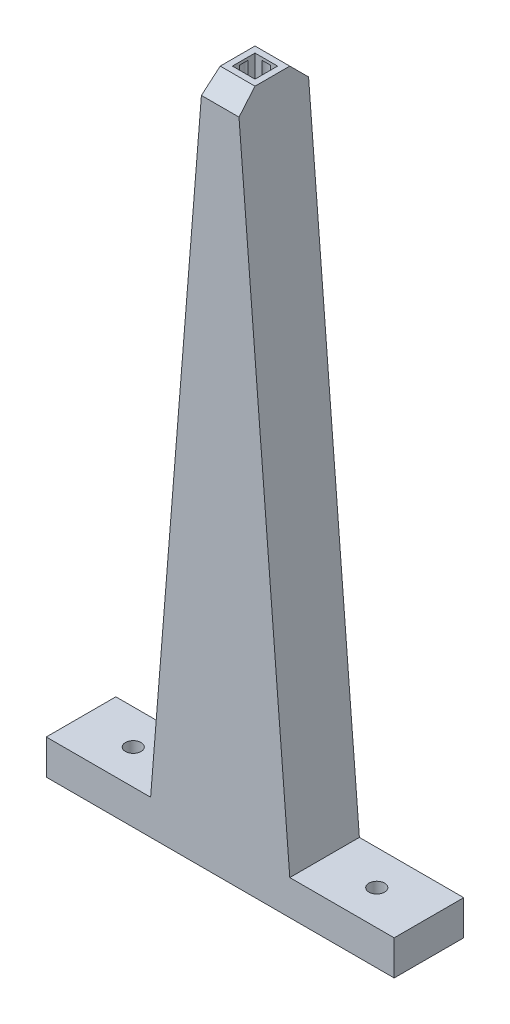
ISO-10303-21;
HEADER;
FILE_DESCRIPTION(('STEP AP214'),'2;1');
FILE_NAME('part.step','',(''),(''),'','','');
FILE_SCHEMA(('AUTOMOTIVE_DESIGN { 1 0 10303 214 1 1 1 1 }'));
ENDSEC;
DATA;
#1=APPLICATION_CONTEXT('core data for automotive mechanical design processes');
#2=APPLICATION_PROTOCOL_DEFINITION('international standard','automotive_design',2000,#1);
#3=PRODUCT_CONTEXT('',#1,'mechanical');
#4=PRODUCT('Part','Part','',(#3));
#5=PRODUCT_RELATED_PRODUCT_CATEGORY('part','',(#4));
#6=PRODUCT_DEFINITION_FORMATION('','',#4);
#7=PRODUCT_DEFINITION_CONTEXT('part definition',#1,'design');
#8=PRODUCT_DEFINITION('design','',#6,#7);
#9=PRODUCT_DEFINITION_SHAPE('','',#8);
#10=(LENGTH_UNIT() NAMED_UNIT(*) SI_UNIT(.MILLI.,.METRE.));
#11=(NAMED_UNIT(*) PLANE_ANGLE_UNIT() SI_UNIT($,.RADIAN.));
#12=(NAMED_UNIT(*) SI_UNIT($,.STERADIAN.) SOLID_ANGLE_UNIT());
#13=UNCERTAINTY_MEASURE_WITH_UNIT(LENGTH_MEASURE(1.E-05),#10,'distance_accuracy_value','');
#14=(GEOMETRIC_REPRESENTATION_CONTEXT(3) GLOBAL_UNCERTAINTY_ASSIGNED_CONTEXT((#13)) GLOBAL_UNIT_ASSIGNED_CONTEXT((#10,
#11,#12)) REPRESENTATION_CONTEXT('',''));
#15=CARTESIAN_POINT('',(0.,0.,0.));
#16=DIRECTION('',(0.,0.,1.));
#17=DIRECTION('',(1.,0.,0.));
#18=AXIS2_PLACEMENT_3D('',#15,#16,#17);
#19=CARTESIAN_POINT('',(46.7500000000002,182.,6.75));
#20=DIRECTION('',(-1.,0.,0.));
#21=DIRECTION('',(0.,0.,1.));
#22=AXIS2_PLACEMENT_3D('',#19,#20,#21);
#23=PLANE('',#22);
#24=DIRECTION('',(0.,0.,1.));
#25=VECTOR('',#24,1.);
#26=CARTESIAN_POINT('',(46.7500000000002,197.,6.75));
#27=LINE('',#26,#25);
#28=CARTESIAN_POINT('',(46.7500000000002,197.,6.75));
#29=VERTEX_POINT('',#28);
#30=CARTESIAN_POINT('',(46.7500000000002,197.,13.25));
#31=VERTEX_POINT('',#30);
#32=EDGE_CURVE('E251',#29,#31,#27,.T.);
#33=ORIENTED_EDGE('',*,*,#32,.T.);
#34=DIRECTION('',(0.,1.,0.));
#35=VECTOR('',#34,1.);
#36=CARTESIAN_POINT('',(46.7500000000002,182.,13.25));
#37=LINE('',#36,#35);
#38=CARTESIAN_POINT('',(46.7500000000002,182.,13.25));
#39=VERTEX_POINT('',#38);
#40=EDGE_CURVE('E324',#39,#31,#37,.T.);
#41=ORIENTED_EDGE('',*,*,#40,.F.);
#42=DIRECTION('',(0.,0.,1.));
#43=VECTOR('',#42,1.);
#44=CARTESIAN_POINT('',(46.7500000000002,182.,6.75));
#45=LINE('',#44,#43);
#46=CARTESIAN_POINT('',(46.7500000000002,182.,6.75));
#47=VERTEX_POINT('',#46);
#48=EDGE_CURVE('E307',#47,#39,#45,.T.);
#49=ORIENTED_EDGE('',*,*,#48,.F.);
#50=DIRECTION('',(0.,1.,0.));
#51=VECTOR('',#50,1.);
#52=CARTESIAN_POINT('',(46.7500000000002,182.,6.75));
#53=LINE('',#52,#51);
#54=EDGE_CURVE('E338',#47,#29,#53,.T.);
#55=ORIENTED_EDGE('',*,*,#54,.T.);
#56=EDGE_LOOP('',(#33,#41,#49,#55));
#57=FACE_BOUND('',#56,.T.);
#58=DIRECTION('',(0.,0.,-1.));
#59=VECTOR('',#58,1.);
#60=CARTESIAN_POINT('',(46.7500000000002,196.2,6.75));
#61=LINE('',#60,#59);
#62=CARTESIAN_POINT('',(46.7500000000002,196.2,11.25));
#63=VERTEX_POINT('',#62);
#64=CARTESIAN_POINT('',(46.7500000000002,196.2,8.75));
#65=VERTEX_POINT('',#64);
#66=EDGE_CURVE('E426',#63,#65,#61,.T.);
#67=ORIENTED_EDGE('',*,*,#66,.T.);
#68=DIRECTION('',(0.,1.,0.));
#69=VECTOR('',#68,1.);
#70=CARTESIAN_POINT('',(46.7500000000002,192.,8.75));
#71=LINE('',#70,#69);
#72=CARTESIAN_POINT('',(46.7500000000002,192.,8.75));
#73=VERTEX_POINT('',#72);
#74=EDGE_CURVE('E284',#73,#65,#71,.T.);
#75=ORIENTED_EDGE('',*,*,#74,.F.);
#76=DIRECTION('',(0.,0.,-1.));
#77=VECTOR('',#76,1.);
#78=CARTESIAN_POINT('',(46.7500000000002,192.,8.75));
#79=LINE('',#78,#77);
#80=CARTESIAN_POINT('',(46.7500000000002,192.,11.25));
#81=VERTEX_POINT('',#80);
#82=EDGE_CURVE('E293',#81,#73,#79,.T.);
#83=ORIENTED_EDGE('',*,*,#82,.F.);
#84=DIRECTION('',(0.,1.,0.));
#85=VECTOR('',#84,1.);
#86=CARTESIAN_POINT('',(46.7500000000002,192.,11.25));
#87=LINE('',#86,#85);
#88=EDGE_CURVE('E298',#81,#63,#87,.T.);
#89=ORIENTED_EDGE('',*,*,#88,.T.);
#90=EDGE_LOOP('',(#67,#75,#83,#89));
#91=FACE_BOUND('',#90,.T.);
#92=ADVANCED_FACE('F42',(#57,#91),#23,.F.);
#93=CARTESIAN_POINT('',(46.7500000000002,182.,6.75));
#94=DIRECTION('',(0.,0.,-1.));
#95=DIRECTION('',(-1.,0.,0.));
#96=AXIS2_PLACEMENT_3D('',#93,#94,#95);
#97=PLANE('',#96);
#98=DIRECTION('',(-1.,0.,0.));
#99=VECTOR('',#98,1.);
#100=CARTESIAN_POINT('',(46.7500000000002,197.,6.75));
#101=LINE('',#100,#99);
#102=CARTESIAN_POINT('',(53.2500000000002,197.,6.75));
#103=VERTEX_POINT('',#102);
#104=EDGE_CURVE('E312',#103,#29,#101,.T.);
#105=ORIENTED_EDGE('',*,*,#104,.T.);
#106=ORIENTED_EDGE('',*,*,#54,.F.);
#107=DIRECTION('',(-1.,0.,0.));
#108=VECTOR('',#107,1.);
#109=CARTESIAN_POINT('',(46.7500000000002,182.,6.75));
#110=LINE('',#109,#108);
#111=CARTESIAN_POINT('',(53.2500000000002,182.,6.75));
#112=VERTEX_POINT('',#111);
#113=EDGE_CURVE('E320',#112,#47,#110,.T.);
#114=ORIENTED_EDGE('',*,*,#113,.F.);
#115=DIRECTION('',(0.,1.,0.));
#116=VECTOR('',#115,1.);
#117=CARTESIAN_POINT('',(53.2500000000002,182.,6.75));
#118=LINE('',#117,#116);
#119=EDGE_CURVE('E342',#112,#103,#118,.T.);
#120=ORIENTED_EDGE('',*,*,#119,.T.);
#121=EDGE_LOOP('',(#105,#106,#114,#120));
#122=FACE_BOUND('',#121,.T.);
#123=DIRECTION('',(1.,0.,0.));
#124=VECTOR('',#123,1.);
#125=CARTESIAN_POINT('',(46.7500000000002,196.2,6.75));
#126=LINE('',#125,#124);
#127=CARTESIAN_POINT('',(48.7500000000002,196.2,6.75));
#128=VERTEX_POINT('',#127);
#129=CARTESIAN_POINT('',(51.2500000000002,196.2,6.75));
#130=VERTEX_POINT('',#129);
#131=EDGE_CURVE('E433',#128,#130,#126,.T.);
#132=ORIENTED_EDGE('',*,*,#131,.T.);
#133=DIRECTION('',(0.,1.,0.));
#134=VECTOR('',#133,1.);
#135=CARTESIAN_POINT('',(51.2500000000002,192.,6.75));
#136=LINE('',#135,#134);
#137=CARTESIAN_POINT('',(51.2500000000002,192.,6.75));
#138=VERTEX_POINT('',#137);
#139=EDGE_CURVE('E233',#138,#130,#136,.T.);
#140=ORIENTED_EDGE('',*,*,#139,.F.);
#141=DIRECTION('',(1.,0.,0.));
#142=VECTOR('',#141,1.);
#143=CARTESIAN_POINT('',(48.7500000000002,192.,6.75));
#144=LINE('',#143,#142);
#145=CARTESIAN_POINT('',(48.7500000000002,192.,6.75));
#146=VERTEX_POINT('',#145);
#147=EDGE_CURVE('E234',#146,#138,#144,.T.);
#148=ORIENTED_EDGE('',*,*,#147,.F.);
#149=DIRECTION('',(0.,1.,0.));
#150=VECTOR('',#149,1.);
#151=CARTESIAN_POINT('',(48.7500000000002,192.,6.75));
#152=LINE('',#151,#150);
#153=EDGE_CURVE('E220',#146,#128,#152,.T.);
#154=ORIENTED_EDGE('',*,*,#153,.T.);
#155=EDGE_LOOP('',(#132,#140,#148,#154));
#156=FACE_BOUND('',#155,.T.);
#157=ADVANCED_FACE('F242',(#122,#156),#97,.F.);
#158=CARTESIAN_POINT('',(53.2500000000002,182.,6.75));
#159=DIRECTION('',(1.,0.,0.));
#160=DIRECTION('',(0.,0.,-1.));
#161=AXIS2_PLACEMENT_3D('',#158,#159,#160);
#162=PLANE('',#161);
#163=DIRECTION('',(0.,0.,-1.));
#164=VECTOR('',#163,1.);
#165=CARTESIAN_POINT('',(53.2500000000002,197.,6.75));
#166=LINE('',#165,#164);
#167=CARTESIAN_POINT('',(53.2500000000002,197.,13.25));
#168=VERTEX_POINT('',#167);
#169=EDGE_CURVE('E331',#168,#103,#166,.T.);
#170=ORIENTED_EDGE('',*,*,#169,.T.);
#171=ORIENTED_EDGE('',*,*,#119,.F.);
#172=DIRECTION('',(0.,0.,-1.));
#173=VECTOR('',#172,1.);
#174=CARTESIAN_POINT('',(53.2500000000002,182.,6.75));
#175=LINE('',#174,#173);
#176=CARTESIAN_POINT('',(53.2500000000002,182.,13.25));
#177=VERTEX_POINT('',#176);
#178=EDGE_CURVE('E316',#177,#112,#175,.T.);
#179=ORIENTED_EDGE('',*,*,#178,.F.);
#180=DIRECTION('',(0.,1.,0.));
#181=VECTOR('',#180,1.);
#182=CARTESIAN_POINT('',(53.2500000000002,182.,13.25));
#183=LINE('',#182,#181);
#184=EDGE_CURVE('E345',#177,#168,#183,.T.);
#185=ORIENTED_EDGE('',*,*,#184,.T.);
#186=EDGE_LOOP('',(#170,#171,#179,#185));
#187=FACE_BOUND('',#186,.T.);
#188=DIRECTION('',(0.,0.,1.));
#189=VECTOR('',#188,1.);
#190=CARTESIAN_POINT('',(53.2500000000002,196.2,6.75));
#191=LINE('',#190,#189);
#192=CARTESIAN_POINT('',(53.2500000000002,196.2,8.74999999999999));
#193=VERTEX_POINT('',#192);
#194=CARTESIAN_POINT('',(53.2500000000002,196.2,11.25));
#195=VERTEX_POINT('',#194);
#196=EDGE_CURVE('E439',#193,#195,#191,.T.);
#197=ORIENTED_EDGE('',*,*,#196,.T.);
#198=DIRECTION('',(0.,1.,0.));
#199=VECTOR('',#198,1.);
#200=CARTESIAN_POINT('',(53.2500000000002,192.,11.25));
#201=LINE('',#200,#199);
#202=CARTESIAN_POINT('',(53.2500000000002,192.,11.25));
#203=VERTEX_POINT('',#202);
#204=EDGE_CURVE('E249',#203,#195,#201,.T.);
#205=ORIENTED_EDGE('',*,*,#204,.F.);
#206=DIRECTION('',(0.,0.,1.));
#207=VECTOR('',#206,1.);
#208=CARTESIAN_POINT('',(53.2500000000002,192.,8.74999999999999));
#209=LINE('',#208,#207);
#210=CARTESIAN_POINT('',(53.2500000000002,192.,8.74999999999999));
#211=VERTEX_POINT('',#210);
#212=EDGE_CURVE('E257',#211,#203,#209,.T.);
#213=ORIENTED_EDGE('',*,*,#212,.F.);
#214=DIRECTION('',(0.,1.,0.));
#215=VECTOR('',#214,1.);
#216=CARTESIAN_POINT('',(53.2500000000002,192.,8.74999999999999));
#217=LINE('',#216,#215);
#218=EDGE_CURVE('E262',#211,#193,#217,.T.);
#219=ORIENTED_EDGE('',*,*,#218,.T.);
#220=EDGE_LOOP('',(#197,#205,#213,#219));
#221=FACE_BOUND('',#220,.T.);
#222=ADVANCED_FACE('F541',(#187,#221),#162,.F.);
#223=CARTESIAN_POINT('',(46.7500000000002,182.,13.25));
#224=DIRECTION('',(0.,0.,1.));
#225=DIRECTION('',(1.,0.,0.));
#226=AXIS2_PLACEMENT_3D('',#223,#224,#225);
#227=PLANE('',#226);
#228=DIRECTION('',(1.,0.,0.));
#229=VECTOR('',#228,1.);
#230=CARTESIAN_POINT('',(46.7500000000002,197.,13.25));
#231=LINE('',#230,#229);
#232=EDGE_CURVE('E327',#31,#168,#231,.T.);
#233=ORIENTED_EDGE('',*,*,#232,.T.);
#234=ORIENTED_EDGE('',*,*,#184,.F.);
#235=DIRECTION('',(1.,0.,0.));
#236=VECTOR('',#235,1.);
#237=CARTESIAN_POINT('',(46.7500000000002,182.,13.25));
#238=LINE('',#237,#236);
#239=EDGE_CURVE('E311',#39,#177,#238,.T.);
#240=ORIENTED_EDGE('',*,*,#239,.F.);
#241=ORIENTED_EDGE('',*,*,#40,.T.);
#242=EDGE_LOOP('',(#233,#234,#240,#241));
#243=FACE_BOUND('',#242,.T.);
#244=DIRECTION('',(-1.,0.,0.));
#245=VECTOR('',#244,1.);
#246=CARTESIAN_POINT('',(46.7500000000002,196.2,13.25));
#247=LINE('',#246,#245);
#248=CARTESIAN_POINT('',(51.2500000000002,196.2,13.25));
#249=VERTEX_POINT('',#248);
#250=CARTESIAN_POINT('',(48.7500000000002,196.2,13.25));
#251=VERTEX_POINT('',#250);
#252=EDGE_CURVE('E446',#249,#251,#247,.T.);
#253=ORIENTED_EDGE('',*,*,#252,.T.);
#254=DIRECTION('',(0.,1.,0.));
#255=VECTOR('',#254,1.);
#256=CARTESIAN_POINT('',(48.7500000000002,192.,13.25));
#257=LINE('',#256,#255);
#258=CARTESIAN_POINT('',(48.7500000000002,192.,13.25));
#259=VERTEX_POINT('',#258);
#260=EDGE_CURVE('E266',#259,#251,#257,.T.);
#261=ORIENTED_EDGE('',*,*,#260,.F.);
#262=DIRECTION('',(-1.,0.,0.));
#263=VECTOR('',#262,1.);
#264=CARTESIAN_POINT('',(48.7500000000002,192.,13.25));
#265=LINE('',#264,#263);
#266=CARTESIAN_POINT('',(51.2500000000002,192.,13.25));
#267=VERTEX_POINT('',#266);
#268=EDGE_CURVE('E275',#267,#259,#265,.T.);
#269=ORIENTED_EDGE('',*,*,#268,.F.);
#270=DIRECTION('',(0.,1.,0.));
#271=VECTOR('',#270,1.);
#272=CARTESIAN_POINT('',(51.2500000000002,192.,13.25));
#273=LINE('',#272,#271);
#274=EDGE_CURVE('E280',#267,#249,#273,.T.);
#275=ORIENTED_EDGE('',*,*,#274,.T.);
#276=EDGE_LOOP('',(#253,#261,#269,#275));
#277=FACE_BOUND('',#276,.T.);
#278=ADVANCED_FACE('F547',(#243,#277),#227,.F.);
#279=CARTESIAN_POINT('',(0.,10.,20.));
#280=DIRECTION('',(1.,0.,0.));
#281=DIRECTION('',(0.,0.,-1.));
#282=AXIS2_PLACEMENT_3D('',#279,#280,#281);
#283=PLANE('',#282);
#284=DIRECTION('',(0.,-1.,0.));
#285=VECTOR('',#284,1.);
#286=CARTESIAN_POINT('',(0.,10.,0.));
#287=LINE('',#286,#285);
#288=CARTESIAN_POINT('',(0.,10.,0.));
#289=VERTEX_POINT('',#288);
#290=CARTESIAN_POINT('',(0.,0.,0.));
#291=VERTEX_POINT('',#290);
#292=EDGE_CURVE('E341',#289,#291,#287,.T.);
#293=ORIENTED_EDGE('',*,*,#292,.T.);
#294=DIRECTION('',(0.,0.,-1.));
#295=VECTOR('',#294,1.);
#296=CARTESIAN_POINT('',(0.,0.,20.));
#297=LINE('',#296,#295);
#298=CARTESIAN_POINT('',(0.,0.,20.));
#299=VERTEX_POINT('',#298);
#300=EDGE_CURVE('E422',#299,#291,#297,.T.);
#301=ORIENTED_EDGE('',*,*,#300,.F.);
#302=DIRECTION('',(0.,-1.,0.));
#303=VECTOR('',#302,1.);
#304=CARTESIAN_POINT('',(0.,10.,20.));
#305=LINE('',#304,#303);
#306=CARTESIAN_POINT('',(0.,10.,20.));
#307=VERTEX_POINT('',#306);
#308=EDGE_CURVE('E351',#307,#299,#305,.T.);
#309=ORIENTED_EDGE('',*,*,#308,.F.);
#310=DIRECTION('',(0.,0.,-1.));
#311=VECTOR('',#310,1.);
#312=CARTESIAN_POINT('',(0.,10.,20.));
#313=LINE('',#312,#311);
#314=EDGE_CURVE('E374',#307,#289,#313,.T.);
#315=ORIENTED_EDGE('',*,*,#314,.T.);
#316=EDGE_LOOP('',(#293,#301,#309,#315));
#317=FACE_BOUND('',#316,.T.);
#318=ADVANCED_FACE('F517',(#317),#283,.F.);
#319=CARTESIAN_POINT('',(0.,0.,20.));
#320=DIRECTION('',(0.,1.,0.));
#321=DIRECTION('',(0.,0.,1.));
#322=AXIS2_PLACEMENT_3D('',#319,#320,#321);
#323=PLANE('',#322);
#324=CARTESIAN_POINT('',(15.,0.,10.));
#325=DIRECTION('',(0.,1.,0.));
#326=DIRECTION('',(-1.,0.,0.));
#327=AXIS2_PLACEMENT_3D('',#324,#325,#326);
#328=CIRCLE('',#327,2.25);
#329=CARTESIAN_POINT('',(12.75,0.,10.));
#330=VERTEX_POINT('',#329);
#331=EDGE_CURVE('E302',#330,#330,#328,.T.);
#332=ORIENTED_EDGE('',*,*,#331,.T.);
#333=EDGE_LOOP('',(#332));
#334=FACE_BOUND('',#333,.T.);
#335=CARTESIAN_POINT('',(85.,0.,10.));
#336=DIRECTION('',(0.,1.,0.));
#337=DIRECTION('',(-1.,0.,0.));
#338=AXIS2_PLACEMENT_3D('',#335,#336,#337);
#339=CIRCLE('',#338,2.25);
#340=CARTESIAN_POINT('',(82.75,0.,10.));
#341=VERTEX_POINT('',#340);
#342=EDGE_CURVE('E691',#341,#341,#339,.T.);
#343=ORIENTED_EDGE('',*,*,#342,.T.);
#344=EDGE_LOOP('',(#343));
#345=FACE_BOUND('',#344,.T.);
#346=DIRECTION('',(1.,0.,0.));
#347=VECTOR('',#346,1.);
#348=CARTESIAN_POINT('',(0.,0.,0.));
#349=LINE('',#348,#347);
#350=CARTESIAN_POINT('',(100.,0.,0.));
#351=VERTEX_POINT('',#350);
#352=EDGE_CURVE('E378',#291,#351,#349,.T.);
#353=ORIENTED_EDGE('',*,*,#352,.T.);
#354=DIRECTION('',(0.,0.,-1.));
#355=VECTOR('',#354,1.);
#356=CARTESIAN_POINT('',(100.,0.,20.));
#357=LINE('',#356,#355);
#358=CARTESIAN_POINT('',(100.,0.,20.));
#359=VERTEX_POINT('',#358);
#360=EDGE_CURVE('E418',#359,#351,#357,.T.);
#361=ORIENTED_EDGE('',*,*,#360,.F.);
#362=DIRECTION('',(1.,0.,0.));
#363=VECTOR('',#362,1.);
#364=CARTESIAN_POINT('',(0.,0.,20.));
#365=LINE('',#364,#363);
#366=EDGE_CURVE('E355',#299,#359,#365,.T.);
#367=ORIENTED_EDGE('',*,*,#366,.F.);
#368=ORIENTED_EDGE('',*,*,#300,.T.);
#369=EDGE_LOOP('',(#353,#361,#367,#368));
#370=FACE_BOUND('',#369,.T.);
#371=ADVANCED_FACE('F571',(#334,#345,#370),#323,.F.);
#372=CARTESIAN_POINT('',(100.,0.,20.));
#373=DIRECTION('',(-1.,0.,0.));
#374=DIRECTION('',(0.,0.,1.));
#375=AXIS2_PLACEMENT_3D('',#372,#373,#374);
#376=PLANE('',#375);
#377=DIRECTION('',(0.,1.,0.));
#378=VECTOR('',#377,1.);
#379=CARTESIAN_POINT('',(100.,0.,0.));
#380=LINE('',#379,#378);
#381=CARTESIAN_POINT('',(100.,10.,0.));
#382=VERTEX_POINT('',#381);
#383=EDGE_CURVE('E381',#351,#382,#380,.T.);
#384=ORIENTED_EDGE('',*,*,#383,.T.);
#385=DIRECTION('',(0.,0.,-1.));
#386=VECTOR('',#385,1.);
#387=CARTESIAN_POINT('',(100.,10.,20.));
#388=LINE('',#387,#386);
#389=CARTESIAN_POINT('',(100.,10.,20.));
#390=VERTEX_POINT('',#389);
#391=EDGE_CURVE('E414',#390,#382,#388,.T.);
#392=ORIENTED_EDGE('',*,*,#391,.F.);
#393=DIRECTION('',(0.,1.,0.));
#394=VECTOR('',#393,1.);
#395=CARTESIAN_POINT('',(100.,0.,20.));
#396=LINE('',#395,#394);
#397=EDGE_CURVE('E359',#359,#390,#396,.T.);
#398=ORIENTED_EDGE('',*,*,#397,.F.);
#399=ORIENTED_EDGE('',*,*,#360,.T.);
#400=EDGE_LOOP('',(#384,#392,#398,#399));
#401=FACE_BOUND('',#400,.T.);
#402=ADVANCED_FACE('F567',(#401),#376,.F.);
#403=CARTESIAN_POINT('',(100.,10.,20.));
#404=DIRECTION('',(0.,-1.,0.));
#405=DIRECTION('',(1.,0.,0.));
#406=AXIS2_PLACEMENT_3D('',#403,#404,#405);
#407=PLANE('',#406);
#408=CARTESIAN_POINT('',(85.,10.,10.));
#409=DIRECTION('',(0.,1.,0.));
#410=DIRECTION('',(-1.,0.,0.));
#411=AXIS2_PLACEMENT_3D('',#408,#409,#410);
#412=CIRCLE('',#411,2.25);
#413=CARTESIAN_POINT('',(82.75,10.,10.));
#414=VERTEX_POINT('',#413);
#415=EDGE_CURVE('E694',#414,#414,#412,.T.);
#416=ORIENTED_EDGE('',*,*,#415,.F.);
#417=EDGE_LOOP('',(#416));
#418=FACE_BOUND('',#417,.T.);
#419=DIRECTION('',(-1.,0.,0.));
#420=VECTOR('',#419,1.);
#421=CARTESIAN_POINT('',(100.,10.,0.));
#422=LINE('',#421,#420);
#423=CARTESIAN_POINT('',(70.,10.,0.));
#424=VERTEX_POINT('',#423);
#425=EDGE_CURVE('E384',#382,#424,#422,.T.);
#426=ORIENTED_EDGE('',*,*,#425,.T.);
#427=DIRECTION('',(0.,0.,-1.));
#428=VECTOR('',#427,1.);
#429=CARTESIAN_POINT('',(70.,10.,20.));
#430=LINE('',#429,#428);
#431=CARTESIAN_POINT('',(70.,10.,20.));
#432=VERTEX_POINT('',#431);
#433=EDGE_CURVE('E410',#432,#424,#430,.T.);
#434=ORIENTED_EDGE('',*,*,#433,.F.);
#435=DIRECTION('',(-1.,0.,0.));
#436=VECTOR('',#435,1.);
#437=CARTESIAN_POINT('',(100.,10.,20.));
#438=LINE('',#437,#436);
#439=EDGE_CURVE('E362',#390,#432,#438,.T.);
#440=ORIENTED_EDGE('',*,*,#439,.F.);
#441=ORIENTED_EDGE('',*,*,#391,.T.);
#442=EDGE_LOOP('',(#426,#434,#440,#441));
#443=FACE_BOUND('',#442,.T.);
#444=ADVANCED_FACE('F564',(#418,#443),#407,.F.);
#445=CARTESIAN_POINT('',(70.,10.,20.));
#446=DIRECTION('',(-0.996798306984167,-0.0799570834479269,0.));
#447=DIRECTION('',(0.0799570834479269,-0.996798306984167,0.));
#448=AXIS2_PLACEMENT_3D('',#445,#446,#447);
#449=PLANE('',#448);
#450=DIRECTION('',(-0.0799570834479268,0.996798306984167,0.));
#451=VECTOR('',#450,1.);
#452=CARTESIAN_POINT('',(70.,10.,0.));
#453=LINE('',#452,#451);
#454=CARTESIAN_POINT('',(55.4010695187168,192.,0.));
#455=VERTEX_POINT('',#454);
#456=EDGE_CURVE('E387',#424,#455,#453,.T.);
#457=ORIENTED_EDGE('',*,*,#456,.T.);
#458=DIRECTION('',(0.0566287772123224,-0.705972089246961,-0.705972089246961));
#459=VECTOR('',#458,1.);
#460=CARTESIAN_POINT('',(55.0000000000002,197.,5.00000000000003));
#461=LINE('',#460,#459);
#462=CARTESIAN_POINT('',(55.0000000000002,197.,5.00000000000003));
#463=VERTEX_POINT('',#462);
#464=EDGE_CURVE('E52',#455,#463,#461,.F.);
#465=ORIENTED_EDGE('',*,*,#464,.T.);
#466=DIRECTION('',(0.,0.,-1.));
#467=VECTOR('',#466,1.);
#468=CARTESIAN_POINT('',(55.0000000000002,197.,20.));
#469=LINE('',#468,#467);
#470=CARTESIAN_POINT('',(55.0000000000002,197.,15.));
#471=VERTEX_POINT('',#470);
#472=EDGE_CURVE('E406',#471,#463,#469,.T.);
#473=ORIENTED_EDGE('',*,*,#472,.F.);
#474=DIRECTION('',(0.0566287772123222,-0.705972089246959,0.705972089246963));
#475=VECTOR('',#474,1.);
#476=CARTESIAN_POINT('',(55.2234083491301,194.214842580847,17.7851574191526));
#477=LINE('',#476,#475);
#478=CARTESIAN_POINT('',(55.4010695187168,192.,20.));
#479=VERTEX_POINT('',#478);
#480=EDGE_CURVE('E59',#471,#479,#477,.T.);
#481=ORIENTED_EDGE('',*,*,#480,.T.);
#482=DIRECTION('',(-0.0799570834479268,0.996798306984167,0.));
#483=VECTOR('',#482,1.);
#484=CARTESIAN_POINT('',(70.,10.,20.));
#485=LINE('',#484,#483);
#486=EDGE_CURVE('E365',#432,#479,#485,.T.);
#487=ORIENTED_EDGE('',*,*,#486,.F.);
#488=ORIENTED_EDGE('',*,*,#433,.T.);
#489=EDGE_LOOP('',(#457,#465,#473,#481,#487,#488));
#490=FACE_BOUND('',#489,.T.);
#491=ADVANCED_FACE('F497',(#490),#449,.F.);
#492=CARTESIAN_POINT('',(55.0000000000002,197.,20.));
#493=DIRECTION('',(0.,-1.,0.));
#494=DIRECTION('',(0.,0.,-1.));
#495=AXIS2_PLACEMENT_3D('',#492,#493,#494);
#496=PLANE('',#495);
#497=ORIENTED_EDGE('',*,*,#232,.F.);
#498=ORIENTED_EDGE('',*,*,#32,.F.);
#499=ORIENTED_EDGE('',*,*,#104,.F.);
#500=ORIENTED_EDGE('',*,*,#169,.F.);
#501=EDGE_LOOP('',(#497,#498,#499,#500));
#502=FACE_BOUND('',#501,.T.);
#503=ORIENTED_EDGE('',*,*,#472,.T.);
#504=DIRECTION('',(-1.,0.,0.));
#505=VECTOR('',#504,1.);
#506=CARTESIAN_POINT('',(55.0000000000002,197.,5.00000000000003));
#507=LINE('',#506,#505);
#508=CARTESIAN_POINT('',(45.0000000000002,197.,5.00000000000003));
#509=VERTEX_POINT('',#508);
#510=EDGE_CURVE('E482',#463,#509,#507,.T.);
#511=ORIENTED_EDGE('',*,*,#510,.T.);
#512=DIRECTION('',(0.,0.,-1.));
#513=VECTOR('',#512,1.);
#514=CARTESIAN_POINT('',(45.0000000000002,197.,20.));
#515=LINE('',#514,#513);
#516=CARTESIAN_POINT('',(45.0000000000002,197.,15.));
#517=VERTEX_POINT('',#516);
#518=EDGE_CURVE('E402',#517,#509,#515,.T.);
#519=ORIENTED_EDGE('',*,*,#518,.F.);
#520=DIRECTION('',(1.,0.,0.));
#521=VECTOR('',#520,1.);
#522=CARTESIAN_POINT('',(55.0000000000002,197.,15.));
#523=LINE('',#522,#521);
#524=EDGE_CURVE('E479',#517,#471,#523,.T.);
#525=ORIENTED_EDGE('',*,*,#524,.T.);
#526=EDGE_LOOP('',(#503,#511,#519,#525));
#527=FACE_BOUND('',#526,.T.);
#528=ADVANCED_FACE('F501',(#502,#527),#496,.F.);
#529=CARTESIAN_POINT('',(45.0000000000002,197.,20.));
#530=DIRECTION('',(0.996798306984167,-0.0799570834479288,0.));
#531=DIRECTION('',(0.0799570834479288,0.996798306984167,0.));
#532=AXIS2_PLACEMENT_3D('',#529,#530,#531);
#533=PLANE('',#532);
#534=ORIENTED_EDGE('',*,*,#518,.T.);
#535=DIRECTION('',(0.0566287772123237,0.705972089246961,0.705972089246961));
#536=VECTOR('',#535,1.);
#537=CARTESIAN_POINT('',(45.0320681840858,197.399783361601,5.39978336160088));
#538=LINE('',#537,#536);
#539=CARTESIAN_POINT('',(44.5989304812836,192.,0.));
#540=VERTEX_POINT('',#539);
#541=EDGE_CURVE('E489',#509,#540,#538,.F.);
#542=ORIENTED_EDGE('',*,*,#541,.T.);
#543=DIRECTION('',(-0.0799570834479288,-0.996798306984167,0.));
#544=VECTOR('',#543,1.);
#545=CARTESIAN_POINT('',(45.0000000000002,197.,0.));
#546=LINE('',#545,#544);
#547=CARTESIAN_POINT('',(30.,10.,0.));
#548=VERTEX_POINT('',#547);
#549=EDGE_CURVE('E390',#540,#548,#546,.T.);
#550=ORIENTED_EDGE('',*,*,#549,.T.);
#551=DIRECTION('',(0.,0.,-1.));
#552=VECTOR('',#551,1.);
#553=CARTESIAN_POINT('',(30.,10.,20.));
#554=LINE('',#553,#552);
#555=CARTESIAN_POINT('',(30.,10.,20.));
#556=VERTEX_POINT('',#555);
#557=EDGE_CURVE('E398',#556,#548,#554,.T.);
#558=ORIENTED_EDGE('',*,*,#557,.F.);
#559=DIRECTION('',(-0.0799570834479288,-0.996798306984167,0.));
#560=VECTOR('',#559,1.);
#561=CARTESIAN_POINT('',(45.0000000000002,197.,20.));
#562=LINE('',#561,#560);
#563=CARTESIAN_POINT('',(44.5989304812836,192.,20.));
#564=VERTEX_POINT('',#563);
#565=EDGE_CURVE('E368',#564,#556,#562,.T.);
#566=ORIENTED_EDGE('',*,*,#565,.F.);
#567=DIRECTION('',(0.0566287772123236,0.705972089246959,-0.705972089246963));
#568=VECTOR('',#567,1.);
#569=CARTESIAN_POINT('',(44.455909810014,190.217008964839,21.782991035161));
#570=LINE('',#569,#568);
#571=EDGE_CURVE('E486',#564,#517,#570,.T.);
#572=ORIENTED_EDGE('',*,*,#571,.T.);
#573=EDGE_LOOP('',(#534,#542,#550,#558,#566,#572));
#574=FACE_BOUND('',#573,.T.);
#575=ADVANCED_FACE('F506',(#574),#533,.F.);
#576=CARTESIAN_POINT('',(30.,10.,20.));
#577=DIRECTION('',(0.,-1.,0.));
#578=DIRECTION('',(1.,0.,0.));
#579=AXIS2_PLACEMENT_3D('',#576,#577,#578);
#580=PLANE('',#579);
#581=CARTESIAN_POINT('',(15.,10.,10.));
#582=DIRECTION('',(0.,1.,0.));
#583=DIRECTION('',(-1.,0.,0.));
#584=AXIS2_PLACEMENT_3D('',#581,#582,#583);
#585=CIRCLE('',#584,2.25);
#586=CARTESIAN_POINT('',(12.75,10.,10.));
#587=VERTEX_POINT('',#586);
#588=EDGE_CURVE('E697',#587,#587,#585,.T.);
#589=ORIENTED_EDGE('',*,*,#588,.F.);
#590=EDGE_LOOP('',(#589));
#591=FACE_BOUND('',#590,.T.);
#592=DIRECTION('',(-1.,0.,0.));
#593=VECTOR('',#592,1.);
#594=CARTESIAN_POINT('',(30.,10.,0.));
#595=LINE('',#594,#593);
#596=EDGE_CURVE('E356',#548,#289,#595,.T.);
#597=ORIENTED_EDGE('',*,*,#596,.T.);
#598=ORIENTED_EDGE('',*,*,#314,.F.);
#599=DIRECTION('',(-1.,0.,0.));
#600=VECTOR('',#599,1.);
#601=CARTESIAN_POINT('',(30.,10.,20.));
#602=LINE('',#601,#600);
#603=EDGE_CURVE('E371',#556,#307,#602,.T.);
#604=ORIENTED_EDGE('',*,*,#603,.F.);
#605=ORIENTED_EDGE('',*,*,#557,.T.);
#606=EDGE_LOOP('',(#597,#598,#604,#605));
#607=FACE_BOUND('',#606,.T.);
#608=ADVANCED_FACE('F513',(#591,#607),#580,.F.);
#609=CARTESIAN_POINT('',(0.,0.,20.));
#610=DIRECTION('',(0.,0.,1.));
#611=DIRECTION('',(1.,0.,0.));
#612=AXIS2_PLACEMENT_3D('',#609,#610,#611);
#613=PLANE('',#612);
#614=ORIENTED_EDGE('',*,*,#486,.T.);
#615=DIRECTION('',(-1.,0.,0.));
#616=VECTOR('',#615,1.);
#617=CARTESIAN_POINT('',(45.0000000000002,192.,20.));
#618=LINE('',#617,#616);
#619=EDGE_CURVE('E11',#479,#564,#618,.T.);
#620=ORIENTED_EDGE('',*,*,#619,.T.);
#621=ORIENTED_EDGE('',*,*,#565,.T.);
#622=ORIENTED_EDGE('',*,*,#603,.T.);
#623=ORIENTED_EDGE('',*,*,#308,.T.);
#624=ORIENTED_EDGE('',*,*,#366,.T.);
#625=ORIENTED_EDGE('',*,*,#397,.T.);
#626=ORIENTED_EDGE('',*,*,#439,.T.);
#627=EDGE_LOOP('',(#614,#620,#621,#622,#623,#624,#625,#626));
#628=FACE_BOUND('',#627,.T.);
#629=ADVANCED_FACE('F520',(#628),#613,.T.);
#630=CARTESIAN_POINT('',(0.,0.,0.));
#631=DIRECTION('',(0.,0.,1.));
#632=DIRECTION('',(1.,0.,0.));
#633=AXIS2_PLACEMENT_3D('',#630,#631,#632);
#634=PLANE('',#633);
#635=ORIENTED_EDGE('',*,*,#549,.F.);
#636=DIRECTION('',(1.,0.,0.));
#637=VECTOR('',#636,1.);
#638=CARTESIAN_POINT('',(0.,192.,0.));
#639=LINE('',#638,#637);
#640=EDGE_CURVE('E67',#540,#455,#639,.T.);
#641=ORIENTED_EDGE('',*,*,#640,.T.);
#642=ORIENTED_EDGE('',*,*,#456,.F.);
#643=ORIENTED_EDGE('',*,*,#425,.F.);
#644=ORIENTED_EDGE('',*,*,#383,.F.);
#645=ORIENTED_EDGE('',*,*,#352,.F.);
#646=ORIENTED_EDGE('',*,*,#292,.F.);
#647=ORIENTED_EDGE('',*,*,#596,.F.);
#648=EDGE_LOOP('',(#635,#641,#642,#643,#644,#645,#646,#647));
#649=FACE_BOUND('',#648,.T.);
#650=ADVANCED_FACE('F509',(#649),#634,.F.);
#651=CARTESIAN_POINT('',(0.,182.,0.));
#652=DIRECTION('',(0.,1.,0.));
#653=DIRECTION('',(0.,0.,1.));
#654=AXIS2_PLACEMENT_3D('',#651,#652,#653);
#655=PLANE('',#654);
#656=ORIENTED_EDGE('',*,*,#48,.T.);
#657=ORIENTED_EDGE('',*,*,#239,.T.);
#658=ORIENTED_EDGE('',*,*,#178,.T.);
#659=ORIENTED_EDGE('',*,*,#113,.T.);
#660=EDGE_LOOP('',(#656,#657,#658,#659));
#661=FACE_BOUND('',#660,.T.);
#662=ADVANCED_FACE('F553',(#661),#655,.T.);
#663=CARTESIAN_POINT('',(50.0000000000002,192.,12.4208438024112));
#664=DIRECTION('',(0.,1.,0.));
#665=DIRECTION('',(0.,0.,1.));
#666=AXIS2_PLACEMENT_3D('',#663,#664,#665);
#667=CYLINDRICAL_SURFACE('',#666,1.49999999999999);
#668=ORIENTED_EDGE('',*,*,#260,.T.);
#669=CARTESIAN_POINT('',(50.0000000000002,197.029156197589,12.4208438024112));
#670=DIRECTION('',(0.,0.707106781186597,0.707106781186499));
#671=DIRECTION('',(0.,0.707106781186499,-0.707106781186597));
#672=AXIS2_PLACEMENT_3D('',#669,#670,#671);
#673=ELLIPSE('',#672,2.12132034355949,1.49999999999999);
#674=CARTESIAN_POINT('',(48.9087449789512,196.,13.45));
#675=VERTEX_POINT('',#674);
#676=EDGE_CURVE('E472',#251,#675,#673,.T.);
#677=ORIENTED_EDGE('',*,*,#676,.T.);
#678=CARTESIAN_POINT('',(50.0000000000002,196.,12.4208438024112));
#679=DIRECTION('',(0.,1.,0.));
#680=DIRECTION('',(0.,0.,1.));
#681=AXIS2_PLACEMENT_3D('',#678,#679,#680);
#682=CIRCLE('',#681,1.49999999999999);
#683=CARTESIAN_POINT('',(51.0912550210491,196.,13.45));
#684=VERTEX_POINT('',#683);
#685=EDGE_CURVE('E276',#675,#684,#682,.T.);
#686=ORIENTED_EDGE('',*,*,#685,.T.);
#687=CARTESIAN_POINT('',(50.0000000000002,197.029156197589,12.4208438024112));
#688=DIRECTION('',(0.,0.707106781186597,0.707106781186499));
#689=DIRECTION('',(0.,0.707106781186499,-0.707106781186597));
#690=AXIS2_PLACEMENT_3D('',#687,#688,#689);
#691=ELLIPSE('',#690,2.12132034355949,1.49999999999999);
#692=EDGE_CURVE('E475',#684,#249,#691,.T.);
#693=ORIENTED_EDGE('',*,*,#692,.T.);
#694=ORIENTED_EDGE('',*,*,#274,.F.);
#695=CARTESIAN_POINT('',(50.0000000000002,192.,12.4208438024112));
#696=DIRECTION('',(0.,1.,0.));
#697=DIRECTION('',(0.,0.,1.));
#698=AXIS2_PLACEMENT_3D('',#695,#696,#697);
#699=CIRCLE('',#698,1.49999999999999);
#700=EDGE_CURVE('E271',#259,#267,#699,.T.);
#701=ORIENTED_EDGE('',*,*,#700,.F.);
#702=EDGE_LOOP('',(#668,#677,#686,#693,#694,#701));
#703=FACE_BOUND('',#702,.T.);
#704=ADVANCED_FACE('F617',(#703),#667,.F.);
#705=CARTESIAN_POINT('',(50.0000000000002,192.,12.4208438024112));
#706=DIRECTION('',(0.,1.,0.));
#707=DIRECTION('',(0.,0.,1.));
#708=AXIS2_PLACEMENT_3D('',#705,#706,#707);
#709=PLANE('',#708);
#710=ORIENTED_EDGE('',*,*,#700,.T.);
#711=ORIENTED_EDGE('',*,*,#268,.T.);
#712=EDGE_LOOP('',(#710,#711));
#713=FACE_BOUND('',#712,.T.);
#714=ADVANCED_FACE('F623',(#713),#709,.T.);
#715=CARTESIAN_POINT('',(50.0000000000002,196.,12.4208438024112));
#716=DIRECTION('',(0.,1.,0.));
#717=DIRECTION('',(0.,0.,1.));
#718=AXIS2_PLACEMENT_3D('',#715,#716,#717);
#719=PLANE('',#718);
#720=ORIENTED_EDGE('',*,*,#685,.F.);
#721=DIRECTION('',(1.,0.,0.));
#722=VECTOR('',#721,1.);
#723=CARTESIAN_POINT('',(50.0000000000002,196.,13.45));
#724=LINE('',#723,#722);
#725=EDGE_CURVE('E450',#675,#684,#724,.T.);
#726=ORIENTED_EDGE('',*,*,#725,.T.);
#727=EDGE_LOOP('',(#720,#726));
#728=FACE_BOUND('',#727,.T.);
#729=ADVANCED_FACE('F620',(#728),#719,.F.);
#730=CARTESIAN_POINT('',(52.4208438024113,192.,10.));
#731=DIRECTION('',(0.,1.,0.));
#732=DIRECTION('',(0.,0.,1.));
#733=AXIS2_PLACEMENT_3D('',#730,#731,#732);
#734=CYLINDRICAL_SURFACE('',#733,1.5);
#735=ORIENTED_EDGE('',*,*,#204,.T.);
#736=CARTESIAN_POINT('',(52.4208438024113,197.029156197589,10.));
#737=DIRECTION('',(0.707106781186499,0.707106781186597,0.));
#738=DIRECTION('',(-0.707106781186597,0.707106781186499,0.));
#739=AXIS2_PLACEMENT_3D('',#736,#737,#738);
#740=ELLIPSE('',#739,2.12132034355949,1.5);
#741=CARTESIAN_POINT('',(53.4500000000002,196.,11.0912550210489));
#742=VERTEX_POINT('',#741);
#743=EDGE_CURVE('E465',#195,#742,#740,.T.);
#744=ORIENTED_EDGE('',*,*,#743,.T.);
#745=CARTESIAN_POINT('',(52.4208438024113,196.,10.));
#746=DIRECTION('',(0.,1.,0.));
#747=DIRECTION('',(0.,0.,1.));
#748=AXIS2_PLACEMENT_3D('',#745,#746,#747);
#749=CIRCLE('',#748,1.5);
#750=CARTESIAN_POINT('',(53.4500000000002,196.,8.90874497895107));
#751=VERTEX_POINT('',#750);
#752=EDGE_CURVE('E258',#742,#751,#749,.T.);
#753=ORIENTED_EDGE('',*,*,#752,.T.);
#754=CARTESIAN_POINT('',(52.4208438024113,197.029156197589,10.));
#755=DIRECTION('',(0.707106781186499,0.707106781186597,0.));
#756=DIRECTION('',(-0.707106781186597,0.707106781186499,0.));
#757=AXIS2_PLACEMENT_3D('',#754,#755,#756);
#758=ELLIPSE('',#757,2.12132034355949,1.5);
#759=EDGE_CURVE('E468',#751,#193,#758,.T.);
#760=ORIENTED_EDGE('',*,*,#759,.T.);
#761=ORIENTED_EDGE('',*,*,#218,.F.);
#762=CARTESIAN_POINT('',(52.4208438024113,192.,10.));
#763=DIRECTION('',(0.,1.,0.));
#764=DIRECTION('',(0.,0.,1.));
#765=AXIS2_PLACEMENT_3D('',#762,#763,#764);
#766=CIRCLE('',#765,1.5);
#767=EDGE_CURVE('E253',#203,#211,#766,.T.);
#768=ORIENTED_EDGE('',*,*,#767,.F.);
#769=EDGE_LOOP('',(#735,#744,#753,#760,#761,#768));
#770=FACE_BOUND('',#769,.T.);
#771=ADVANCED_FACE('F622',(#770),#734,.F.);
#772=CARTESIAN_POINT('',(52.4208438024113,192.,10.));
#773=DIRECTION('',(0.,1.,0.));
#774=DIRECTION('',(0.,0.,1.));
#775=AXIS2_PLACEMENT_3D('',#772,#773,#774);
#776=PLANE('',#775);
#777=ORIENTED_EDGE('',*,*,#767,.T.);
#778=ORIENTED_EDGE('',*,*,#212,.T.);
#779=EDGE_LOOP('',(#777,#778));
#780=FACE_BOUND('',#779,.T.);
#781=ADVANCED_FACE('F629',(#780),#776,.T.);
#782=CARTESIAN_POINT('',(52.4208438024113,196.,10.));
#783=DIRECTION('',(0.,1.,0.));
#784=DIRECTION('',(0.,0.,1.));
#785=AXIS2_PLACEMENT_3D('',#782,#783,#784);
#786=PLANE('',#785);
#787=ORIENTED_EDGE('',*,*,#752,.F.);
#788=DIRECTION('',(0.,0.,-1.));
#789=VECTOR('',#788,1.);
#790=CARTESIAN_POINT('',(53.4500000000002,196.,10.));
#791=LINE('',#790,#789);
#792=EDGE_CURVE('E443',#742,#751,#791,.T.);
#793=ORIENTED_EDGE('',*,*,#792,.T.);
#794=EDGE_LOOP('',(#787,#793));
#795=FACE_BOUND('',#794,.T.);
#796=ADVANCED_FACE('F668',(#795),#786,.F.);
#797=CARTESIAN_POINT('',(50.0000000000002,192.,7.57915619758886));
#798=DIRECTION('',(0.,1.,0.));
#799=DIRECTION('',(0.,0.,1.));
#800=AXIS2_PLACEMENT_3D('',#797,#798,#799);
#801=CYLINDRICAL_SURFACE('',#800,1.50000000000001);
#802=ORIENTED_EDGE('',*,*,#139,.T.);
#803=CARTESIAN_POINT('',(50.0000000000002,197.029156197589,7.57915619758886));
#804=DIRECTION('',(0.,0.707106781186548,-0.707106781186548));
#805=DIRECTION('',(0.,0.707106781186548,0.707106781186548));
#806=AXIS2_PLACEMENT_3D('',#803,#804,#805);
#807=ELLIPSE('',#806,2.12132034355965,1.50000000000001);
#808=CARTESIAN_POINT('',(51.0912550210491,196.,6.55));
#809=VERTEX_POINT('',#808);
#810=EDGE_CURVE('E460',#130,#809,#807,.T.);
#811=ORIENTED_EDGE('',*,*,#810,.T.);
#812=CARTESIAN_POINT('',(50.0000000000002,196.,7.57915619758886));
#813=DIRECTION('',(0.,1.,0.));
#814=DIRECTION('',(0.,0.,1.));
#815=AXIS2_PLACEMENT_3D('',#812,#813,#814);
#816=CIRCLE('',#815,1.50000000000001);
#817=CARTESIAN_POINT('',(48.9087449789513,196.,6.55));
#818=VERTEX_POINT('',#817);
#819=EDGE_CURVE('E240',#809,#818,#816,.T.);
#820=ORIENTED_EDGE('',*,*,#819,.T.);
#821=CARTESIAN_POINT('',(50.0000000000002,197.029156197589,7.57915619758886));
#822=DIRECTION('',(0.,0.707106781186548,-0.707106781186548));
#823=DIRECTION('',(0.,0.707106781186548,0.707106781186548));
#824=AXIS2_PLACEMENT_3D('',#821,#822,#823);
#825=ELLIPSE('',#824,2.12132034355965,1.50000000000001);
#826=EDGE_CURVE('E227',#818,#128,#825,.T.);
#827=ORIENTED_EDGE('',*,*,#826,.T.);
#828=ORIENTED_EDGE('',*,*,#153,.F.);
#829=CARTESIAN_POINT('',(50.0000000000002,192.,7.57915619758886));
#830=DIRECTION('',(0.,1.,0.));
#831=DIRECTION('',(0.,0.,1.));
#832=AXIS2_PLACEMENT_3D('',#829,#830,#831);
#833=CIRCLE('',#832,1.50000000000001);
#834=EDGE_CURVE('E223',#138,#146,#833,.T.);
#835=ORIENTED_EDGE('',*,*,#834,.F.);
#836=EDGE_LOOP('',(#802,#811,#820,#827,#828,#835));
#837=FACE_BOUND('',#836,.T.);
#838=ADVANCED_FACE('F222',(#837),#801,.F.);
#839=CARTESIAN_POINT('',(50.0000000000002,192.,7.57915619758886));
#840=DIRECTION('',(0.,1.,0.));
#841=DIRECTION('',(0.,0.,1.));
#842=AXIS2_PLACEMENT_3D('',#839,#840,#841);
#843=PLANE('',#842);
#844=ORIENTED_EDGE('',*,*,#834,.T.);
#845=ORIENTED_EDGE('',*,*,#147,.T.);
#846=EDGE_LOOP('',(#844,#845));
#847=FACE_BOUND('',#846,.T.);
#848=ADVANCED_FACE('F237',(#847),#843,.T.);
#849=CARTESIAN_POINT('',(50.0000000000002,196.,7.57915619758886));
#850=DIRECTION('',(0.,1.,0.));
#851=DIRECTION('',(0.,0.,1.));
#852=AXIS2_PLACEMENT_3D('',#849,#850,#851);
#853=PLANE('',#852);
#854=ORIENTED_EDGE('',*,*,#819,.F.);
#855=DIRECTION('',(-1.,0.,0.));
#856=VECTOR('',#855,1.);
#857=CARTESIAN_POINT('',(50.0000000000002,196.,6.55));
#858=LINE('',#857,#856);
#859=EDGE_CURVE('E436',#809,#818,#858,.T.);
#860=ORIENTED_EDGE('',*,*,#859,.T.);
#861=EDGE_LOOP('',(#854,#860));
#862=FACE_BOUND('',#861,.T.);
#863=ADVANCED_FACE('F647',(#862),#853,.F.);
#864=CARTESIAN_POINT('',(47.579156197589,192.,9.99999999999999));
#865=DIRECTION('',(0.,1.,0.));
#866=DIRECTION('',(0.,0.,1.));
#867=AXIS2_PLACEMENT_3D('',#864,#865,#866);
#868=CYLINDRICAL_SURFACE('',#867,1.49999999999999);
#869=ORIENTED_EDGE('',*,*,#74,.T.);
#870=CARTESIAN_POINT('',(47.579156197589,197.029156197589,9.99999999999999));
#871=DIRECTION('',(-0.707106781186499,0.707106781186597,0.));
#872=DIRECTION('',(0.707106781186597,0.707106781186499,0.));
#873=AXIS2_PLACEMENT_3D('',#870,#871,#872);
#874=ELLIPSE('',#873,2.12132034355949,1.49999999999999);
#875=CARTESIAN_POINT('',(46.5500000000002,196.,8.90874497895107));
#876=VERTEX_POINT('',#875);
#877=EDGE_CURVE('E453',#65,#876,#874,.T.);
#878=ORIENTED_EDGE('',*,*,#877,.T.);
#879=CARTESIAN_POINT('',(47.579156197589,196.,9.99999999999999));
#880=DIRECTION('',(0.,1.,0.));
#881=DIRECTION('',(0.,0.,1.));
#882=AXIS2_PLACEMENT_3D('',#879,#880,#881);
#883=CIRCLE('',#882,1.49999999999999);
#884=CARTESIAN_POINT('',(46.5500000000002,196.,11.0912550210489));
#885=VERTEX_POINT('',#884);
#886=EDGE_CURVE('E294',#876,#885,#883,.T.);
#887=ORIENTED_EDGE('',*,*,#886,.T.);
#888=CARTESIAN_POINT('',(47.579156197589,197.029156197589,9.99999999999999));
#889=DIRECTION('',(-0.707106781186499,0.707106781186597,0.));
#890=DIRECTION('',(0.707106781186597,0.707106781186499,0.));
#891=AXIS2_PLACEMENT_3D('',#888,#889,#890);
#892=ELLIPSE('',#891,2.12132034355949,1.49999999999999);
#893=EDGE_CURVE('E456',#885,#63,#892,.T.);
#894=ORIENTED_EDGE('',*,*,#893,.T.);
#895=ORIENTED_EDGE('',*,*,#88,.F.);
#896=CARTESIAN_POINT('',(47.579156197589,192.,9.99999999999999));
#897=DIRECTION('',(0.,1.,0.));
#898=DIRECTION('',(0.,0.,1.));
#899=AXIS2_PLACEMENT_3D('',#896,#897,#898);
#900=CIRCLE('',#899,1.49999999999999);
#901=EDGE_CURVE('E289',#73,#81,#900,.T.);
#902=ORIENTED_EDGE('',*,*,#901,.F.);
#903=EDGE_LOOP('',(#869,#878,#887,#894,#895,#902));
#904=FACE_BOUND('',#903,.T.);
#905=ADVANCED_FACE('F640',(#904),#868,.F.);
#906=CARTESIAN_POINT('',(47.579156197589,192.,9.99999999999999));
#907=DIRECTION('',(0.,1.,0.));
#908=DIRECTION('',(0.,0.,1.));
#909=AXIS2_PLACEMENT_3D('',#906,#907,#908);
#910=PLANE('',#909);
#911=ORIENTED_EDGE('',*,*,#901,.T.);
#912=ORIENTED_EDGE('',*,*,#82,.T.);
#913=EDGE_LOOP('',(#911,#912));
#914=FACE_BOUND('',#913,.T.);
#915=ADVANCED_FACE('F637',(#914),#910,.T.);
#916=CARTESIAN_POINT('',(47.579156197589,196.,9.99999999999999));
#917=DIRECTION('',(0.,1.,0.));
#918=DIRECTION('',(0.,0.,1.));
#919=AXIS2_PLACEMENT_3D('',#916,#917,#918);
#920=PLANE('',#919);
#921=ORIENTED_EDGE('',*,*,#886,.F.);
#922=DIRECTION('',(0.,0.,1.));
#923=VECTOR('',#922,1.);
#924=CARTESIAN_POINT('',(46.5500000000002,196.,9.99999999999999));
#925=LINE('',#924,#923);
#926=EDGE_CURVE('E430',#876,#885,#925,.T.);
#927=ORIENTED_EDGE('',*,*,#926,.T.);
#928=EDGE_LOOP('',(#921,#927));
#929=FACE_BOUND('',#928,.T.);
#930=ADVANCED_FACE('F586',(#929),#920,.F.);
#931=CARTESIAN_POINT('',(46.7500000000002,196.2,6.75));
#932=DIRECTION('',(-0.707106781186499,0.707106781186597,0.));
#933=DIRECTION('',(0.,0.,-1.));
#934=AXIS2_PLACEMENT_3D('',#931,#932,#933);
#935=PLANE('',#934);
#936=ORIENTED_EDGE('',*,*,#893,.F.);
#937=ORIENTED_EDGE('',*,*,#926,.F.);
#938=ORIENTED_EDGE('',*,*,#877,.F.);
#939=ORIENTED_EDGE('',*,*,#66,.F.);
#940=EDGE_LOOP('',(#936,#937,#938,#939));
#941=FACE_BOUND('',#940,.T.);
#942=ADVANCED_FACE('F579',(#941),#935,.F.);
#943=CARTESIAN_POINT('',(46.7500000000002,196.2,6.75));
#944=DIRECTION('',(0.,0.707106781186548,-0.707106781186548));
#945=DIRECTION('',(1.,0.,0.));
#946=AXIS2_PLACEMENT_3D('',#943,#944,#945);
#947=PLANE('',#946);
#948=ORIENTED_EDGE('',*,*,#826,.F.);
#949=ORIENTED_EDGE('',*,*,#859,.F.);
#950=ORIENTED_EDGE('',*,*,#810,.F.);
#951=ORIENTED_EDGE('',*,*,#131,.F.);
#952=EDGE_LOOP('',(#948,#949,#950,#951));
#953=FACE_BOUND('',#952,.T.);
#954=ADVANCED_FACE('F585',(#953),#947,.F.);
#955=CARTESIAN_POINT('',(53.2500000000002,196.2,6.75));
#956=DIRECTION('',(0.707106781186499,0.707106781186597,0.));
#957=DIRECTION('',(0.,0.,1.));
#958=AXIS2_PLACEMENT_3D('',#955,#956,#957);
#959=PLANE('',#958);
#960=ORIENTED_EDGE('',*,*,#759,.F.);
#961=ORIENTED_EDGE('',*,*,#792,.F.);
#962=ORIENTED_EDGE('',*,*,#743,.F.);
#963=ORIENTED_EDGE('',*,*,#196,.F.);
#964=EDGE_LOOP('',(#960,#961,#962,#963));
#965=FACE_BOUND('',#964,.T.);
#966=ADVANCED_FACE('F593',(#965),#959,.F.);
#967=CARTESIAN_POINT('',(46.7500000000002,196.2,13.25));
#968=DIRECTION('',(0.,0.707106781186597,0.707106781186499));
#969=DIRECTION('',(-1.,0.,0.));
#970=AXIS2_PLACEMENT_3D('',#967,#968,#969);
#971=PLANE('',#970);
#972=ORIENTED_EDGE('',*,*,#692,.F.);
#973=ORIENTED_EDGE('',*,*,#725,.F.);
#974=ORIENTED_EDGE('',*,*,#676,.F.);
#975=ORIENTED_EDGE('',*,*,#252,.F.);
#976=EDGE_LOOP('',(#972,#973,#974,#975));
#977=FACE_BOUND('',#976,.T.);
#978=ADVANCED_FACE('F534',(#977),#971,.F.);
#979=CARTESIAN_POINT('',(55.0000000000002,197.,5.00000000000003));
#980=DIRECTION('',(0.,-0.707106781186547,0.707106781186547));
#981=DIRECTION('',(-1.,0.,0.));
#982=AXIS2_PLACEMENT_3D('',#979,#980,#981);
#983=PLANE('',#982);
#984=ORIENTED_EDGE('',*,*,#464,.F.);
#985=ORIENTED_EDGE('',*,*,#640,.F.);
#986=ORIENTED_EDGE('',*,*,#541,.F.);
#987=ORIENTED_EDGE('',*,*,#510,.F.);
#988=EDGE_LOOP('',(#984,#985,#986,#987));
#989=FACE_BOUND('',#988,.T.);
#990=ADVANCED_FACE('F504',(#989),#983,.F.);
#991=CARTESIAN_POINT('',(0.,192.,20.));
#992=DIRECTION('',(0.,0.707106781186549,0.707106781186546));
#993=DIRECTION('',(1.,0.,0.));
#994=AXIS2_PLACEMENT_3D('',#991,#992,#993);
#995=PLANE('',#994);
#996=ORIENTED_EDGE('',*,*,#480,.F.);
#997=ORIENTED_EDGE('',*,*,#524,.F.);
#998=ORIENTED_EDGE('',*,*,#571,.F.);
#999=ORIENTED_EDGE('',*,*,#619,.F.);
#1000=EDGE_LOOP('',(#996,#997,#998,#999));
#1001=FACE_BOUND('',#1000,.T.);
#1002=ADVANCED_FACE('F45',(#1001),#995,.T.);
#1003=CARTESIAN_POINT('',(15.,0.,10.));
#1004=DIRECTION('',(0.,1.,0.));
#1005=DIRECTION('',(-1.,0.,0.));
#1006=AXIS2_PLACEMENT_3D('',#1003,#1004,#1005);
#1007=CYLINDRICAL_SURFACE('',#1006,2.25);
#1008=ORIENTED_EDGE('',*,*,#331,.F.);
#1009=EDGE_LOOP('',(#1008));
#1010=FACE_BOUND('',#1009,.T.);
#1011=ORIENTED_EDGE('',*,*,#588,.T.);
#1012=EDGE_LOOP('',(#1011));
#1013=FACE_BOUND('',#1012,.T.);
#1014=ADVANCED_FACE('F526',(#1010,#1013),#1007,.F.);
#1015=CARTESIAN_POINT('',(85.,0.,10.));
#1016=DIRECTION('',(0.,1.,0.));
#1017=DIRECTION('',(-1.,0.,0.));
#1018=AXIS2_PLACEMENT_3D('',#1015,#1016,#1017);
#1019=CYLINDRICAL_SURFACE('',#1018,2.25);
#1020=ORIENTED_EDGE('',*,*,#342,.F.);
#1021=EDGE_LOOP('',(#1020));
#1022=FACE_BOUND('',#1021,.T.);
#1023=ORIENTED_EDGE('',*,*,#415,.T.);
#1024=EDGE_LOOP('',(#1023));
#1025=FACE_BOUND('',#1024,.T.);
#1026=ADVANCED_FACE('F531',(#1022,#1025),#1019,.F.);
#1027=CLOSED_SHELL('',(#92,#157,#222,#278,#318,#371,#402,#444,#491,#528,#575,#608,#629,#650,
#662,#704,#714,#729,#771,#781,#796,#838,#848,#863,#905,#915,#930,#942,#954,#966,#978,#990,#1002,
#1014,#1026));
#1028=MANIFOLD_SOLID_BREP('B2',#1027);
#1029=ADVANCED_BREP_SHAPE_REPRESENTATION('',(#18,#1028),#14);
#1030=SHAPE_DEFINITION_REPRESENTATION(#9,#1029);
ENDSEC;
END-ISO-10303-21;
